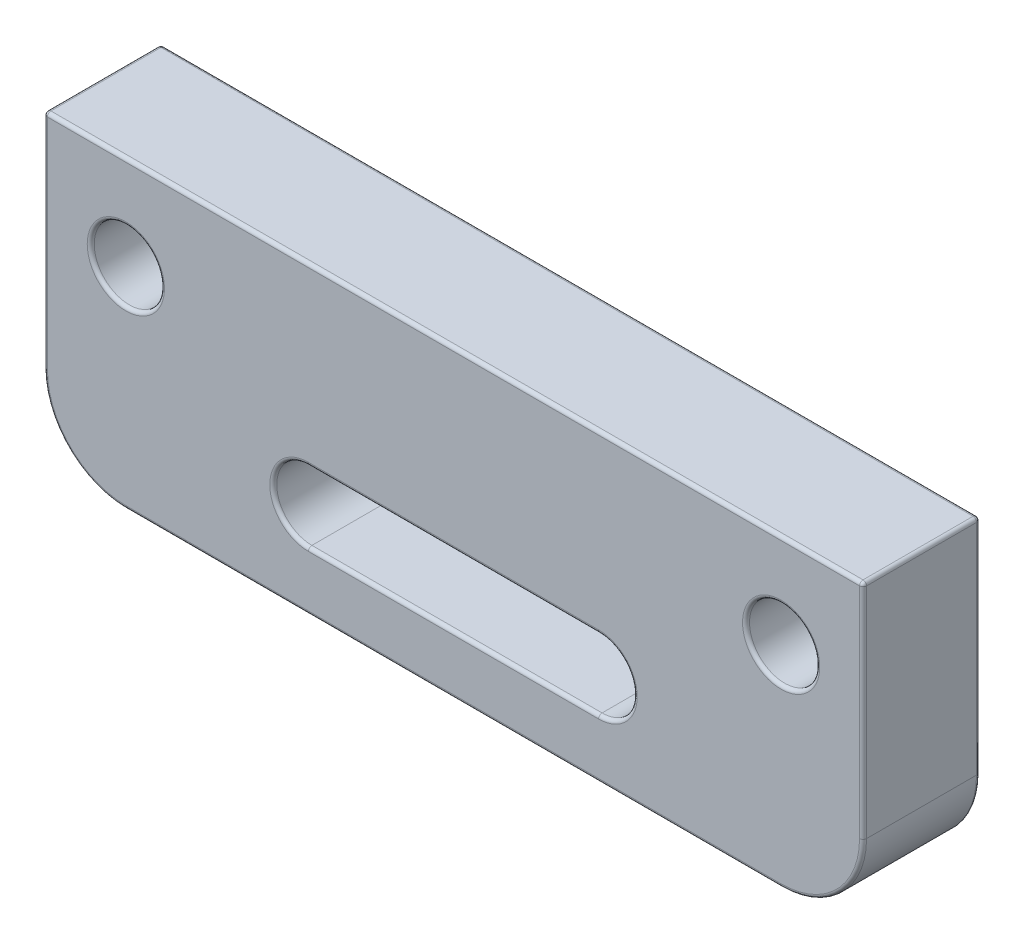
ISO-10303-21;
HEADER;
FILE_DESCRIPTION(('STEP AP214'),'2;1');
FILE_NAME('part.step','',(''),(''),'','','');
FILE_SCHEMA(('AUTOMOTIVE_DESIGN { 1 0 10303 214 1 1 1 1 }'));
ENDSEC;
DATA;
#1=APPLICATION_CONTEXT('core data for automotive mechanical design processes');
#2=APPLICATION_PROTOCOL_DEFINITION('international standard','automotive_design',2000,#1);
#3=PRODUCT_CONTEXT('',#1,'mechanical');
#4=PRODUCT('Part','Part','',(#3));
#5=PRODUCT_RELATED_PRODUCT_CATEGORY('part','',(#4));
#6=PRODUCT_DEFINITION_FORMATION('','',#4);
#7=PRODUCT_DEFINITION_CONTEXT('part definition',#1,'design');
#8=PRODUCT_DEFINITION('design','',#6,#7);
#9=PRODUCT_DEFINITION_SHAPE('','',#8);
#10=(LENGTH_UNIT() NAMED_UNIT(*) SI_UNIT(.MILLI.,.METRE.));
#11=(NAMED_UNIT(*) PLANE_ANGLE_UNIT() SI_UNIT($,.RADIAN.));
#12=(NAMED_UNIT(*) SI_UNIT($,.STERADIAN.) SOLID_ANGLE_UNIT());
#13=UNCERTAINTY_MEASURE_WITH_UNIT(LENGTH_MEASURE(1.E-05),#10,'distance_accuracy_value','');
#14=(GEOMETRIC_REPRESENTATION_CONTEXT(3) GLOBAL_UNCERTAINTY_ASSIGNED_CONTEXT((#13)) GLOBAL_UNIT_ASSIGNED_CONTEXT((#10,
#11,#12)) REPRESENTATION_CONTEXT('',''));
#15=CARTESIAN_POINT('',(0.,0.,0.));
#16=DIRECTION('',(0.,0.,1.));
#17=DIRECTION('',(1.,0.,0.));
#18=AXIS2_PLACEMENT_3D('',#15,#16,#17);
#19=CARTESIAN_POINT('',(0.,8.49264705882353,5.));
#20=DIRECTION('',(0.,0.,-1.));
#21=DIRECTION('',(-1.,0.,0.));
#22=AXIS2_PLACEMENT_3D('',#19,#20,#21);
#23=PLANE('',#22);
#24=CARTESIAN_POINT('',(14.,-15.5,5.));
#25=DIRECTION('',(0.,0.,-1.));
#26=DIRECTION('',(-1.,0.,0.));
#27=AXIS2_PLACEMENT_3D('',#24,#25,#26);
#28=CIRCLE('',#27,3.35);
#29=CARTESIAN_POINT('',(14.,-18.85,5.));
#30=VERTEX_POINT('',#29);
#31=CARTESIAN_POINT('',(17.35,-15.5,5.));
#32=VERTEX_POINT('',#31);
#33=EDGE_CURVE('E41',#30,#32,#28,.F.);
#34=ORIENTED_EDGE('',*,*,#33,.T.);
#35=DIRECTION('',(0.,1.,0.));
#36=VECTOR('',#35,1.);
#37=CARTESIAN_POINT('',(17.35,8.49264705882353,5.));
#38=LINE('',#37,#36);
#39=CARTESIAN_POINT('',(17.35,-6.15,5.));
#40=VERTEX_POINT('',#39);
#41=EDGE_CURVE('E11',#32,#40,#38,.T.);
#42=ORIENTED_EDGE('',*,*,#41,.T.);
#43=DIRECTION('',(1.,0.,0.));
#44=VECTOR('',#43,1.);
#45=CARTESIAN_POINT('',(-17.5,-6.15,5.));
#46=LINE('',#45,#44);
#47=CARTESIAN_POINT('',(-17.35,-6.15,5.));
#48=VERTEX_POINT('',#47);
#49=EDGE_CURVE('E323',#40,#48,#46,.F.);
#50=ORIENTED_EDGE('',*,*,#49,.T.);
#51=DIRECTION('',(0.,-1.,0.));
#52=VECTOR('',#51,1.);
#53=CARTESIAN_POINT('',(-17.35,8.49264705882353,5.));
#54=LINE('',#53,#52);
#55=CARTESIAN_POINT('',(-17.35,-15.5,5.));
#56=VERTEX_POINT('',#55);
#57=EDGE_CURVE('E325',#48,#56,#54,.T.);
#58=ORIENTED_EDGE('',*,*,#57,.T.);
#59=CARTESIAN_POINT('',(-14.,-15.5,5.));
#60=DIRECTION('',(0.,0.,-1.));
#61=DIRECTION('',(-1.,0.,0.));
#62=AXIS2_PLACEMENT_3D('',#59,#60,#61);
#63=CIRCLE('',#62,3.35);
#64=CARTESIAN_POINT('',(-14.,-18.85,5.));
#65=VERTEX_POINT('',#64);
#66=EDGE_CURVE('E327',#56,#65,#63,.F.);
#67=ORIENTED_EDGE('',*,*,#66,.T.);
#68=DIRECTION('',(1.,0.,0.));
#69=VECTOR('',#68,1.);
#70=CARTESIAN_POINT('',(0.,-18.85,5.));
#71=LINE('',#70,#69);
#72=EDGE_CURVE('E52',#65,#30,#71,.T.);
#73=ORIENTED_EDGE('',*,*,#72,.T.);
#74=EDGE_LOOP('',(#34,#42,#50,#58,#67,#73));
#75=FACE_BOUND('',#74,.T.);
#76=CARTESIAN_POINT('',(-14.,-10.,5.));
#77=DIRECTION('',(0.,0.,-1.));
#78=DIRECTION('',(-1.,0.,0.));
#79=AXIS2_PLACEMENT_3D('',#76,#77,#78);
#80=CIRCLE('',#79,1.65);
#81=CARTESIAN_POINT('',(-15.65,-10.,5.));
#82=VERTEX_POINT('',#81);
#83=EDGE_CURVE('E320',#82,#82,#80,.T.);
#84=ORIENTED_EDGE('',*,*,#83,.T.);
#85=EDGE_LOOP('',(#84));
#86=FACE_BOUND('',#85,.T.);
#87=CARTESIAN_POINT('',(6.2,-15.,5.));
#88=DIRECTION('',(0.,0.,-1.));
#89=DIRECTION('',(-1.,0.,0.));
#90=AXIS2_PLACEMENT_3D('',#87,#88,#89);
#91=CIRCLE('',#90,1.65);
#92=CARTESIAN_POINT('',(6.2,-13.35,5.));
#93=VERTEX_POINT('',#92);
#94=CARTESIAN_POINT('',(6.2,-16.65,5.));
#95=VERTEX_POINT('',#94);
#96=EDGE_CURVE('E315',#93,#95,#91,.T.);
#97=ORIENTED_EDGE('',*,*,#96,.T.);
#98=DIRECTION('',(1.,0.,0.));
#99=VECTOR('',#98,1.);
#100=CARTESIAN_POINT('',(-6.2,-16.65,5.));
#101=LINE('',#100,#99);
#102=CARTESIAN_POINT('',(-6.2,-16.65,5.));
#103=VERTEX_POINT('',#102);
#104=EDGE_CURVE('E317',#95,#103,#101,.F.);
#105=ORIENTED_EDGE('',*,*,#104,.T.);
#106=CARTESIAN_POINT('',(-6.2,-15.,5.));
#107=DIRECTION('',(0.,0.,-1.));
#108=DIRECTION('',(-1.,0.,0.));
#109=AXIS2_PLACEMENT_3D('',#106,#107,#108);
#110=CIRCLE('',#109,1.65);
#111=CARTESIAN_POINT('',(-6.2,-13.35,5.));
#112=VERTEX_POINT('',#111);
#113=EDGE_CURVE('E311',#103,#112,#110,.T.);
#114=ORIENTED_EDGE('',*,*,#113,.T.);
#115=DIRECTION('',(-1.,0.,0.));
#116=VECTOR('',#115,1.);
#117=CARTESIAN_POINT('',(6.2,-13.35,5.));
#118=LINE('',#117,#116);
#119=EDGE_CURVE('E313',#112,#93,#118,.F.);
#120=ORIENTED_EDGE('',*,*,#119,.T.);
#121=EDGE_LOOP('',(#97,#105,#114,#120));
#122=FACE_BOUND('',#121,.T.);
#123=CARTESIAN_POINT('',(14.,-10.,5.));
#124=DIRECTION('',(0.,0.,-1.));
#125=DIRECTION('',(-1.,0.,0.));
#126=AXIS2_PLACEMENT_3D('',#123,#124,#125);
#127=CIRCLE('',#126,1.65);
#128=CARTESIAN_POINT('',(12.35,-10.,5.));
#129=VERTEX_POINT('',#128);
#130=EDGE_CURVE('E308',#129,#129,#127,.T.);
#131=ORIENTED_EDGE('',*,*,#130,.T.);
#132=EDGE_LOOP('',(#131));
#133=FACE_BOUND('',#132,.T.);
#134=ADVANCED_FACE('F32',(#75,#86,#122,#133),#23,.F.);
#135=CARTESIAN_POINT('',(0.,8.49264705882353,0.));
#136=DIRECTION('',(0.,0.,-1.));
#137=DIRECTION('',(-1.,0.,0.));
#138=AXIS2_PLACEMENT_3D('',#135,#136,#137);
#139=PLANE('',#138);
#140=DIRECTION('',(1.,0.,0.));
#141=VECTOR('',#140,1.);
#142=CARTESIAN_POINT('',(-14.,-18.85,0.));
#143=LINE('',#142,#141);
#144=CARTESIAN_POINT('',(14.,-18.85,0.));
#145=VERTEX_POINT('',#144);
#146=CARTESIAN_POINT('',(-14.,-18.85,0.));
#147=VERTEX_POINT('',#146);
#148=EDGE_CURVE('E261',#145,#147,#143,.F.);
#149=ORIENTED_EDGE('',*,*,#148,.T.);
#150=CARTESIAN_POINT('',(-14.,-15.5,0.));
#151=DIRECTION('',(0.,0.,-1.));
#152=DIRECTION('',(-1.,0.,0.));
#153=AXIS2_PLACEMENT_3D('',#150,#151,#152);
#154=CIRCLE('',#153,3.35);
#155=CARTESIAN_POINT('',(-17.35,-15.5,0.));
#156=VERTEX_POINT('',#155);
#157=EDGE_CURVE('E263',#147,#156,#154,.T.);
#158=ORIENTED_EDGE('',*,*,#157,.T.);
#159=DIRECTION('',(0.,-1.,0.));
#160=VECTOR('',#159,1.);
#161=CARTESIAN_POINT('',(-17.35,-6.,0.));
#162=LINE('',#161,#160);
#163=CARTESIAN_POINT('',(-17.35,-6.15,0.));
#164=VERTEX_POINT('',#163);
#165=EDGE_CURVE('E253',#156,#164,#162,.F.);
#166=ORIENTED_EDGE('',*,*,#165,.T.);
#167=DIRECTION('',(1.,0.,0.));
#168=VECTOR('',#167,1.);
#169=CARTESIAN_POINT('',(0.,-6.15,0.));
#170=LINE('',#169,#168);
#171=CARTESIAN_POINT('',(17.35,-6.15,0.));
#172=VERTEX_POINT('',#171);
#173=EDGE_CURVE('E255',#164,#172,#170,.T.);
#174=ORIENTED_EDGE('',*,*,#173,.T.);
#175=DIRECTION('',(0.,1.,0.));
#176=VECTOR('',#175,1.);
#177=CARTESIAN_POINT('',(17.35,-15.5,0.));
#178=LINE('',#177,#176);
#179=CARTESIAN_POINT('',(17.35,-15.5,0.));
#180=VERTEX_POINT('',#179);
#181=EDGE_CURVE('E257',#172,#180,#178,.F.);
#182=ORIENTED_EDGE('',*,*,#181,.T.);
#183=CARTESIAN_POINT('',(14.,-15.5,0.));
#184=DIRECTION('',(0.,0.,-1.));
#185=DIRECTION('',(-1.,0.,0.));
#186=AXIS2_PLACEMENT_3D('',#183,#184,#185);
#187=CIRCLE('',#186,3.35);
#188=EDGE_CURVE('E259',#180,#145,#187,.T.);
#189=ORIENTED_EDGE('',*,*,#188,.T.);
#190=EDGE_LOOP('',(#149,#158,#166,#174,#182,#189));
#191=FACE_BOUND('',#190,.T.);
#192=CARTESIAN_POINT('',(-14.,-10.,0.));
#193=DIRECTION('',(0.,0.,-1.));
#194=DIRECTION('',(-1.,0.,0.));
#195=AXIS2_PLACEMENT_3D('',#192,#193,#194);
#196=CIRCLE('',#195,1.65);
#197=CARTESIAN_POINT('',(-15.65,-10.,0.));
#198=VERTEX_POINT('',#197);
#199=EDGE_CURVE('E250',#198,#198,#196,.F.);
#200=ORIENTED_EDGE('',*,*,#199,.T.);
#201=EDGE_LOOP('',(#200));
#202=FACE_BOUND('',#201,.T.);
#203=DIRECTION('',(1.,0.,0.));
#204=VECTOR('',#203,1.);
#205=CARTESIAN_POINT('',(0.,-16.65,0.));
#206=LINE('',#205,#204);
#207=CARTESIAN_POINT('',(-6.2,-16.65,0.));
#208=VERTEX_POINT('',#207);
#209=CARTESIAN_POINT('',(6.2,-16.65,0.));
#210=VERTEX_POINT('',#209);
#211=EDGE_CURVE('E245',#208,#210,#206,.T.);
#212=ORIENTED_EDGE('',*,*,#211,.T.);
#213=CARTESIAN_POINT('',(6.2,-15.,0.));
#214=DIRECTION('',(0.,0.,-1.));
#215=DIRECTION('',(-1.,0.,0.));
#216=AXIS2_PLACEMENT_3D('',#213,#214,#215);
#217=CIRCLE('',#216,1.65);
#218=CARTESIAN_POINT('',(6.2,-13.35,0.));
#219=VERTEX_POINT('',#218);
#220=EDGE_CURVE('E247',#210,#219,#217,.F.);
#221=ORIENTED_EDGE('',*,*,#220,.T.);
#222=DIRECTION('',(-1.,0.,0.));
#223=VECTOR('',#222,1.);
#224=CARTESIAN_POINT('',(0.,-13.35,0.));
#225=LINE('',#224,#223);
#226=CARTESIAN_POINT('',(-6.2,-13.35,0.));
#227=VERTEX_POINT('',#226);
#228=EDGE_CURVE('E241',#219,#227,#225,.T.);
#229=ORIENTED_EDGE('',*,*,#228,.T.);
#230=CARTESIAN_POINT('',(-6.2,-15.,0.));
#231=DIRECTION('',(0.,0.,-1.));
#232=DIRECTION('',(-1.,0.,0.));
#233=AXIS2_PLACEMENT_3D('',#230,#231,#232);
#234=CIRCLE('',#233,1.65);
#235=EDGE_CURVE('E243',#227,#208,#234,.F.);
#236=ORIENTED_EDGE('',*,*,#235,.T.);
#237=EDGE_LOOP('',(#212,#221,#229,#236));
#238=FACE_BOUND('',#237,.T.);
#239=CARTESIAN_POINT('',(14.,-10.,0.));
#240=DIRECTION('',(0.,0.,-1.));
#241=DIRECTION('',(-1.,0.,0.));
#242=AXIS2_PLACEMENT_3D('',#239,#240,#241);
#243=CIRCLE('',#242,1.65);
#244=CARTESIAN_POINT('',(12.35,-10.,0.));
#245=VERTEX_POINT('',#244);
#246=EDGE_CURVE('E238',#245,#245,#243,.F.);
#247=ORIENTED_EDGE('',*,*,#246,.T.);
#248=EDGE_LOOP('',(#247));
#249=FACE_BOUND('',#248,.T.);
#250=ADVANCED_FACE('F488',(#191,#202,#238,#249),#139,.T.);
#251=CARTESIAN_POINT('',(-17.5,9.,5.));
#252=DIRECTION('',(1.,0.,0.));
#253=DIRECTION('',(0.,0.,-1.));
#254=AXIS2_PLACEMENT_3D('',#251,#252,#253);
#255=PLANE('',#254);
#256=DIRECTION('',(0.,0.,1.));
#257=VECTOR('',#256,1.);
#258=CARTESIAN_POINT('',(-17.5,-6.15,0.));
#259=LINE('',#258,#257);
#260=CARTESIAN_POINT('',(-17.5,-6.15,4.85));
#261=VERTEX_POINT('',#260);
#262=CARTESIAN_POINT('',(-17.5,-6.15,0.15));
#263=VERTEX_POINT('',#262);
#264=EDGE_CURVE('E199',#261,#263,#259,.F.);
#265=ORIENTED_EDGE('',*,*,#264,.T.);
#266=DIRECTION('',(0.,-1.,0.));
#267=VECTOR('',#266,1.);
#268=CARTESIAN_POINT('',(-17.5,-15.5,0.15));
#269=LINE('',#268,#267);
#270=CARTESIAN_POINT('',(-17.5,-15.5,0.15));
#271=VERTEX_POINT('',#270);
#272=EDGE_CURVE('E236',#263,#271,#269,.T.);
#273=ORIENTED_EDGE('',*,*,#272,.T.);
#274=DIRECTION('',(0.,0.,-1.));
#275=VECTOR('',#274,1.);
#276=CARTESIAN_POINT('',(-17.5,-15.5,5.));
#277=LINE('',#276,#275);
#278=CARTESIAN_POINT('',(-17.5,-15.5,4.85));
#279=VERTEX_POINT('',#278);
#280=EDGE_CURVE('E217',#271,#279,#277,.F.);
#281=ORIENTED_EDGE('',*,*,#280,.T.);
#282=DIRECTION('',(0.,-1.,0.));
#283=VECTOR('',#282,1.);
#284=CARTESIAN_POINT('',(-17.5,9.,4.85));
#285=LINE('',#284,#283);
#286=EDGE_CURVE('E233',#279,#261,#285,.F.);
#287=ORIENTED_EDGE('',*,*,#286,.T.);
#288=EDGE_LOOP('',(#265,#273,#281,#287));
#289=FACE_BOUND('',#288,.T.);
#290=ADVANCED_FACE('F473',(#289),#255,.F.);
#291=CARTESIAN_POINT('',(17.5,9.,5.));
#292=DIRECTION('',(-1.,0.,0.));
#293=DIRECTION('',(0.,0.,1.));
#294=AXIS2_PLACEMENT_3D('',#291,#292,#293);
#295=PLANE('',#294);
#296=DIRECTION('',(0.,0.,-1.));
#297=VECTOR('',#296,1.);
#298=CARTESIAN_POINT('',(17.5,-15.5,5.));
#299=LINE('',#298,#297);
#300=CARTESIAN_POINT('',(17.5,-15.5,4.85));
#301=VERTEX_POINT('',#300);
#302=CARTESIAN_POINT('',(17.5,-15.5,0.15));
#303=VERTEX_POINT('',#302);
#304=EDGE_CURVE('E429',#301,#303,#299,.T.);
#305=ORIENTED_EDGE('',*,*,#304,.T.);
#306=DIRECTION('',(0.,1.,0.));
#307=VECTOR('',#306,1.);
#308=CARTESIAN_POINT('',(17.5,-6.,0.15));
#309=LINE('',#308,#307);
#310=CARTESIAN_POINT('',(17.5,-6.15,0.15));
#311=VERTEX_POINT('',#310);
#312=EDGE_CURVE('E231',#303,#311,#309,.T.);
#313=ORIENTED_EDGE('',*,*,#312,.T.);
#314=DIRECTION('',(0.,0.,-1.));
#315=VECTOR('',#314,1.);
#316=CARTESIAN_POINT('',(17.5,-6.15,5.));
#317=LINE('',#316,#315);
#318=CARTESIAN_POINT('',(17.5,-6.15,4.85));
#319=VERTEX_POINT('',#318);
#320=EDGE_CURVE('E228',#311,#319,#317,.F.);
#321=ORIENTED_EDGE('',*,*,#320,.T.);
#322=DIRECTION('',(0.,1.,0.));
#323=VECTOR('',#322,1.);
#324=CARTESIAN_POINT('',(17.5,9.,4.85));
#325=LINE('',#324,#323);
#326=EDGE_CURVE('E226',#319,#301,#325,.F.);
#327=ORIENTED_EDGE('',*,*,#326,.T.);
#328=EDGE_LOOP('',(#305,#313,#321,#327));
#329=FACE_BOUND('',#328,.T.);
#330=ADVANCED_FACE('F524',(#329),#295,.F.);
#331=CARTESIAN_POINT('',(-17.5,-19.,5.));
#332=DIRECTION('',(0.,1.,0.));
#333=DIRECTION('',(0.,0.,1.));
#334=AXIS2_PLACEMENT_3D('',#331,#332,#333);
#335=PLANE('',#334);
#336=DIRECTION('',(0.,0.,-1.));
#337=VECTOR('',#336,1.);
#338=CARTESIAN_POINT('',(-14.,-19.,5.));
#339=LINE('',#338,#337);
#340=CARTESIAN_POINT('',(-14.,-19.,4.85));
#341=VERTEX_POINT('',#340);
#342=CARTESIAN_POINT('',(-14.,-19.,0.15));
#343=VERTEX_POINT('',#342);
#344=EDGE_CURVE('E436',#341,#343,#339,.T.);
#345=ORIENTED_EDGE('',*,*,#344,.T.);
#346=DIRECTION('',(1.,0.,0.));
#347=VECTOR('',#346,1.);
#348=CARTESIAN_POINT('',(14.,-19.,0.15));
#349=LINE('',#348,#347);
#350=CARTESIAN_POINT('',(14.,-19.,0.15));
#351=VERTEX_POINT('',#350);
#352=EDGE_CURVE('E272',#343,#351,#349,.T.);
#353=ORIENTED_EDGE('',*,*,#352,.T.);
#354=DIRECTION('',(0.,0.,-1.));
#355=VECTOR('',#354,1.);
#356=CARTESIAN_POINT('',(14.,-19.,5.));
#357=LINE('',#356,#355);
#358=CARTESIAN_POINT('',(14.,-19.,4.85));
#359=VERTEX_POINT('',#358);
#360=EDGE_CURVE('E220',#351,#359,#357,.F.);
#361=ORIENTED_EDGE('',*,*,#360,.T.);
#362=DIRECTION('',(1.,0.,0.));
#363=VECTOR('',#362,1.);
#364=CARTESIAN_POINT('',(-17.5,-19.,4.85));
#365=LINE('',#364,#363);
#366=EDGE_CURVE('E270',#359,#341,#365,.F.);
#367=ORIENTED_EDGE('',*,*,#366,.T.);
#368=EDGE_LOOP('',(#345,#353,#361,#367));
#369=FACE_BOUND('',#368,.T.);
#370=ADVANCED_FACE('F442',(#369),#335,.F.);
#371=CARTESIAN_POINT('',(11.5,-6.,5.));
#372=DIRECTION('',(0.,1.,0.));
#373=DIRECTION('',(-1.,0.,0.));
#374=AXIS2_PLACEMENT_3D('',#371,#372,#373);
#375=PLANE('',#374);
#376=DIRECTION('',(0.,0.,-1.));
#377=VECTOR('',#376,1.);
#378=CARTESIAN_POINT('',(17.35,-6.,0.));
#379=LINE('',#378,#377);
#380=CARTESIAN_POINT('',(17.35,-6.,4.85));
#381=VERTEX_POINT('',#380);
#382=CARTESIAN_POINT('',(17.35,-6.,0.15));
#383=VERTEX_POINT('',#382);
#384=EDGE_CURVE('E192',#381,#383,#379,.T.);
#385=ORIENTED_EDGE('',*,*,#384,.T.);
#386=DIRECTION('',(1.,0.,0.));
#387=VECTOR('',#386,1.);
#388=CARTESIAN_POINT('',(11.5,-6.,0.15));
#389=LINE('',#388,#387);
#390=CARTESIAN_POINT('',(-17.35,-6.,0.15));
#391=VERTEX_POINT('',#390);
#392=EDGE_CURVE('E188',#383,#391,#389,.F.);
#393=ORIENTED_EDGE('',*,*,#392,.T.);
#394=DIRECTION('',(0.,0.,1.));
#395=VECTOR('',#394,1.);
#396=CARTESIAN_POINT('',(-17.35,-6.,5.));
#397=LINE('',#396,#395);
#398=CARTESIAN_POINT('',(-17.35,-6.,4.85));
#399=VERTEX_POINT('',#398);
#400=EDGE_CURVE('E180',#391,#399,#397,.T.);
#401=ORIENTED_EDGE('',*,*,#400,.T.);
#402=DIRECTION('',(1.,0.,0.));
#403=VECTOR('',#402,1.);
#404=CARTESIAN_POINT('',(17.5,-6.,4.85));
#405=LINE('',#404,#403);
#406=EDGE_CURVE('E185',#399,#381,#405,.T.);
#407=ORIENTED_EDGE('',*,*,#406,.T.);
#408=EDGE_LOOP('',(#385,#393,#401,#407));
#409=FACE_BOUND('',#408,.T.);
#410=ADVANCED_FACE('F183',(#409),#375,.T.);
#411=CARTESIAN_POINT('',(-14.,-10.,5.));
#412=DIRECTION('',(0.,0.,-1.));
#413=DIRECTION('',(-1.,0.,0.));
#414=AXIS2_PLACEMENT_3D('',#411,#412,#413);
#415=CYLINDRICAL_SURFACE('',#414,1.5);
#416=CARTESIAN_POINT('',(-14.,-10.,0.15));
#417=DIRECTION('',(0.,0.,-1.));
#418=DIRECTION('',(-1.,0.,0.));
#419=AXIS2_PLACEMENT_3D('',#416,#417,#418);
#420=CIRCLE('',#419,1.5);
#421=CARTESIAN_POINT('',(-15.5,-10.,0.15));
#422=VERTEX_POINT('',#421);
#423=EDGE_CURVE('E281',#422,#422,#420,.T.);
#424=ORIENTED_EDGE('',*,*,#423,.T.);
#425=EDGE_LOOP('',(#424));
#426=FACE_BOUND('',#425,.T.);
#427=CARTESIAN_POINT('',(-14.,-10.,4.85));
#428=DIRECTION('',(0.,0.,-1.));
#429=DIRECTION('',(-1.,0.,0.));
#430=AXIS2_PLACEMENT_3D('',#427,#428,#429);
#431=CIRCLE('',#430,1.5);
#432=CARTESIAN_POINT('',(-15.5,-10.,4.85));
#433=VERTEX_POINT('',#432);
#434=EDGE_CURVE('E278',#433,#433,#431,.F.);
#435=ORIENTED_EDGE('',*,*,#434,.T.);
#436=EDGE_LOOP('',(#435));
#437=FACE_BOUND('',#436,.T.);
#438=ADVANCED_FACE('F795',(#426,#437),#415,.F.);
#439=CARTESIAN_POINT('',(-6.2,-15.,5.));
#440=DIRECTION('',(0.,0.,-1.));
#441=DIRECTION('',(-1.,0.,0.));
#442=AXIS2_PLACEMENT_3D('',#439,#440,#441);
#443=CYLINDRICAL_SURFACE('',#442,1.5);
#444=DIRECTION('',(0.,0.,-1.));
#445=VECTOR('',#444,1.);
#446=CARTESIAN_POINT('',(-6.2,-16.5,5.));
#447=LINE('',#446,#445);
#448=CARTESIAN_POINT('',(-6.2,-16.5,4.85));
#449=VERTEX_POINT('',#448);
#450=CARTESIAN_POINT('',(-6.2,-16.5,0.15));
#451=VERTEX_POINT('',#450);
#452=EDGE_CURVE('E424',#449,#451,#447,.T.);
#453=ORIENTED_EDGE('',*,*,#452,.T.);
#454=CARTESIAN_POINT('',(-6.2,-15.,0.15));
#455=DIRECTION('',(0.,0.,-1.));
#456=DIRECTION('',(-1.,0.,0.));
#457=AXIS2_PLACEMENT_3D('',#454,#455,#456);
#458=CIRCLE('',#457,1.5);
#459=CARTESIAN_POINT('',(-6.2,-13.5,0.15));
#460=VERTEX_POINT('',#459);
#461=EDGE_CURVE('E296',#451,#460,#458,.T.);
#462=ORIENTED_EDGE('',*,*,#461,.T.);
#463=DIRECTION('',(0.,0.,-1.));
#464=VECTOR('',#463,1.);
#465=CARTESIAN_POINT('',(-6.2,-13.5,5.));
#466=LINE('',#465,#464);
#467=CARTESIAN_POINT('',(-6.2,-13.5,4.85));
#468=VERTEX_POINT('',#467);
#469=EDGE_CURVE('E376',#468,#460,#466,.T.);
#470=ORIENTED_EDGE('',*,*,#469,.F.);
#471=CARTESIAN_POINT('',(-6.2,-15.,4.85));
#472=DIRECTION('',(0.,0.,-1.));
#473=DIRECTION('',(-1.,0.,0.));
#474=AXIS2_PLACEMENT_3D('',#471,#472,#473);
#475=CIRCLE('',#474,1.5);
#476=EDGE_CURVE('E294',#468,#449,#475,.F.);
#477=ORIENTED_EDGE('',*,*,#476,.T.);
#478=EDGE_LOOP('',(#453,#462,#470,#477));
#479=FACE_BOUND('',#478,.T.);
#480=ADVANCED_FACE('F860',(#479),#443,.F.);
#481=CARTESIAN_POINT('',(-6.2,-16.5,5.));
#482=DIRECTION('',(0.,1.,0.));
#483=DIRECTION('',(0.,0.,1.));
#484=AXIS2_PLACEMENT_3D('',#481,#482,#483);
#485=PLANE('',#484);
#486=DIRECTION('',(0.,0.,-1.));
#487=VECTOR('',#486,1.);
#488=CARTESIAN_POINT('',(6.2,-16.5,5.));
#489=LINE('',#488,#487);
#490=CARTESIAN_POINT('',(6.2,-16.5,4.85));
#491=VERTEX_POINT('',#490);
#492=CARTESIAN_POINT('',(6.2,-16.5,0.15));
#493=VERTEX_POINT('',#492);
#494=EDGE_CURVE('E422',#491,#493,#489,.T.);
#495=ORIENTED_EDGE('',*,*,#494,.T.);
#496=DIRECTION('',(1.,0.,0.));
#497=VECTOR('',#496,1.);
#498=CARTESIAN_POINT('',(-6.2,-16.5,0.15));
#499=LINE('',#498,#497);
#500=EDGE_CURVE('E292',#493,#451,#499,.F.);
#501=ORIENTED_EDGE('',*,*,#500,.T.);
#502=ORIENTED_EDGE('',*,*,#452,.F.);
#503=DIRECTION('',(1.,0.,0.));
#504=VECTOR('',#503,1.);
#505=CARTESIAN_POINT('',(6.2,-16.5,4.85));
#506=LINE('',#505,#504);
#507=EDGE_CURVE('E289',#449,#491,#506,.T.);
#508=ORIENTED_EDGE('',*,*,#507,.T.);
#509=EDGE_LOOP('',(#495,#501,#502,#508));
#510=FACE_BOUND('',#509,.T.);
#511=ADVANCED_FACE('F421',(#510),#485,.T.);
#512=CARTESIAN_POINT('',(6.2,-15.,5.));
#513=DIRECTION('',(0.,0.,-1.));
#514=DIRECTION('',(-1.,0.,0.));
#515=AXIS2_PLACEMENT_3D('',#512,#513,#514);
#516=CYLINDRICAL_SURFACE('',#515,1.5);
#517=DIRECTION('',(0.,0.,-1.));
#518=VECTOR('',#517,1.);
#519=CARTESIAN_POINT('',(6.2,-13.5,5.));
#520=LINE('',#519,#518);
#521=CARTESIAN_POINT('',(6.2,-13.5,4.85));
#522=VERTEX_POINT('',#521);
#523=CARTESIAN_POINT('',(6.2,-13.5,0.15));
#524=VERTEX_POINT('',#523);
#525=EDGE_CURVE('E427',#522,#524,#520,.T.);
#526=ORIENTED_EDGE('',*,*,#525,.T.);
#527=CARTESIAN_POINT('',(6.2,-15.,0.15));
#528=DIRECTION('',(0.,0.,-1.));
#529=DIRECTION('',(-1.,0.,0.));
#530=AXIS2_PLACEMENT_3D('',#527,#528,#529);
#531=CIRCLE('',#530,1.5);
#532=EDGE_CURVE('E286',#524,#493,#531,.T.);
#533=ORIENTED_EDGE('',*,*,#532,.T.);
#534=ORIENTED_EDGE('',*,*,#494,.F.);
#535=CARTESIAN_POINT('',(6.2,-15.,4.85));
#536=DIRECTION('',(0.,0.,-1.));
#537=DIRECTION('',(-1.,0.,0.));
#538=AXIS2_PLACEMENT_3D('',#535,#536,#537);
#539=CIRCLE('',#538,1.5);
#540=EDGE_CURVE('E284',#491,#522,#539,.F.);
#541=ORIENTED_EDGE('',*,*,#540,.T.);
#542=EDGE_LOOP('',(#526,#533,#534,#541));
#543=FACE_BOUND('',#542,.T.);
#544=ADVANCED_FACE('F425',(#543),#516,.F.);
#545=CARTESIAN_POINT('',(-6.2,-13.5,5.));
#546=DIRECTION('',(0.,-1.,0.));
#547=DIRECTION('',(0.,0.,-1.));
#548=AXIS2_PLACEMENT_3D('',#545,#546,#547);
#549=PLANE('',#548);
#550=ORIENTED_EDGE('',*,*,#469,.T.);
#551=DIRECTION('',(-1.,0.,0.));
#552=VECTOR('',#551,1.);
#553=CARTESIAN_POINT('',(-6.2,-13.5,0.15));
#554=LINE('',#553,#552);
#555=EDGE_CURVE('E300',#460,#524,#554,.F.);
#556=ORIENTED_EDGE('',*,*,#555,.T.);
#557=ORIENTED_EDGE('',*,*,#525,.F.);
#558=DIRECTION('',(-1.,0.,0.));
#559=VECTOR('',#558,1.);
#560=CARTESIAN_POINT('',(-6.2,-13.5,4.85));
#561=LINE('',#560,#559);
#562=EDGE_CURVE('E298',#522,#468,#561,.T.);
#563=ORIENTED_EDGE('',*,*,#562,.T.);
#564=EDGE_LOOP('',(#550,#556,#557,#563));
#565=FACE_BOUND('',#564,.T.);
#566=ADVANCED_FACE('F836',(#565),#549,.T.);
#567=CARTESIAN_POINT('',(14.,-10.,5.));
#568=DIRECTION('',(0.,0.,-1.));
#569=DIRECTION('',(-1.,0.,0.));
#570=AXIS2_PLACEMENT_3D('',#567,#568,#569);
#571=CYLINDRICAL_SURFACE('',#570,1.5);
#572=CARTESIAN_POINT('',(14.,-10.,0.15));
#573=DIRECTION('',(0.,0.,-1.));
#574=DIRECTION('',(-1.,0.,0.));
#575=AXIS2_PLACEMENT_3D('',#572,#573,#574);
#576=CIRCLE('',#575,1.5);
#577=CARTESIAN_POINT('',(12.5,-10.,0.15));
#578=VERTEX_POINT('',#577);
#579=EDGE_CURVE('E305',#578,#578,#576,.T.);
#580=ORIENTED_EDGE('',*,*,#579,.T.);
#581=EDGE_LOOP('',(#580));
#582=FACE_BOUND('',#581,.T.);
#583=CARTESIAN_POINT('',(14.,-10.,4.85));
#584=DIRECTION('',(0.,0.,-1.));
#585=DIRECTION('',(-1.,0.,0.));
#586=AXIS2_PLACEMENT_3D('',#583,#584,#585);
#587=CIRCLE('',#586,1.5);
#588=CARTESIAN_POINT('',(12.5,-10.,4.85));
#589=VERTEX_POINT('',#588);
#590=EDGE_CURVE('E302',#589,#589,#587,.F.);
#591=ORIENTED_EDGE('',*,*,#590,.T.);
#592=EDGE_LOOP('',(#591));
#593=FACE_BOUND('',#592,.T.);
#594=ADVANCED_FACE('F535',(#582,#593),#571,.F.);
#595=CARTESIAN_POINT('',(14.,-15.5,5.));
#596=DIRECTION('',(0.,0.,-1.));
#597=DIRECTION('',(-1.,0.,0.));
#598=AXIS2_PLACEMENT_3D('',#595,#596,#597);
#599=CYLINDRICAL_SURFACE('',#598,3.5);
#600=ORIENTED_EDGE('',*,*,#360,.F.);
#601=CARTESIAN_POINT('',(14.,-15.5,0.15));
#602=DIRECTION('',(0.,0.,-1.));
#603=DIRECTION('',(-1.,0.,0.));
#604=AXIS2_PLACEMENT_3D('',#601,#602,#603);
#605=CIRCLE('',#604,3.5);
#606=EDGE_CURVE('E276',#351,#303,#605,.F.);
#607=ORIENTED_EDGE('',*,*,#606,.T.);
#608=ORIENTED_EDGE('',*,*,#304,.F.);
#609=CARTESIAN_POINT('',(14.,-15.5,4.85));
#610=DIRECTION('',(0.,0.,-1.));
#611=DIRECTION('',(-1.,0.,0.));
#612=AXIS2_PLACEMENT_3D('',#609,#610,#611);
#613=CIRCLE('',#612,3.5);
#614=EDGE_CURVE('E274',#301,#359,#613,.T.);
#615=ORIENTED_EDGE('',*,*,#614,.T.);
#616=EDGE_LOOP('',(#600,#607,#608,#615));
#617=FACE_BOUND('',#616,.T.);
#618=ADVANCED_FACE('F532',(#617),#599,.T.);
#619=CARTESIAN_POINT('',(-14.,-15.5,5.));
#620=DIRECTION('',(0.,0.,-1.));
#621=DIRECTION('',(-1.,0.,0.));
#622=AXIS2_PLACEMENT_3D('',#619,#620,#621);
#623=CYLINDRICAL_SURFACE('',#622,3.5);
#624=ORIENTED_EDGE('',*,*,#280,.F.);
#625=CARTESIAN_POINT('',(-14.,-15.5,0.15));
#626=DIRECTION('',(0.,0.,-1.));
#627=DIRECTION('',(-1.,0.,0.));
#628=AXIS2_PLACEMENT_3D('',#625,#626,#627);
#629=CIRCLE('',#628,3.5);
#630=EDGE_CURVE('E268',#271,#343,#629,.F.);
#631=ORIENTED_EDGE('',*,*,#630,.T.);
#632=ORIENTED_EDGE('',*,*,#344,.F.);
#633=CARTESIAN_POINT('',(-14.,-15.5,4.85));
#634=DIRECTION('',(0.,0.,-1.));
#635=DIRECTION('',(-1.,0.,0.));
#636=AXIS2_PLACEMENT_3D('',#633,#634,#635);
#637=CIRCLE('',#636,3.5);
#638=EDGE_CURVE('E266',#341,#279,#637,.T.);
#639=ORIENTED_EDGE('',*,*,#638,.T.);
#640=EDGE_LOOP('',(#624,#631,#632,#639));
#641=FACE_BOUND('',#640,.T.);
#642=ADVANCED_FACE('F470',(#641),#623,.T.);
#643=CARTESIAN_POINT('',(-14.,-15.5,4.85));
#644=DIRECTION('',(0.,0.,-1.));
#645=DIRECTION('',(-1.,0.,0.));
#646=AXIS2_PLACEMENT_3D('',#643,#644,#645);
#647=TOROIDAL_SURFACE('',#646,3.35,0.15);
#648=CARTESIAN_POINT('',(-17.35,-15.5,4.85));
#649=DIRECTION('',(0.,1.,0.));
#650=DIRECTION('',(0.,0.,1.));
#651=AXIS2_PLACEMENT_3D('',#648,#649,#650);
#652=CIRCLE('',#651,0.15);
#653=EDGE_CURVE('E370',#279,#56,#652,.T.);
#654=ORIENTED_EDGE('',*,*,#653,.F.);
#655=ORIENTED_EDGE('',*,*,#638,.F.);
#656=CARTESIAN_POINT('',(-14.,-18.85,4.85));
#657=DIRECTION('',(1.,0.,0.));
#658=DIRECTION('',(0.,0.,-1.));
#659=AXIS2_PLACEMENT_3D('',#656,#657,#658);
#660=CIRCLE('',#659,0.15);
#661=EDGE_CURVE('E373',#65,#341,#660,.T.);
#662=ORIENTED_EDGE('',*,*,#661,.F.);
#663=ORIENTED_EDGE('',*,*,#66,.F.);
#664=EDGE_LOOP('',(#654,#655,#662,#663));
#665=FACE_BOUND('',#664,.T.);
#666=ADVANCED_FACE('F467',(#665),#647,.T.);
#667=CARTESIAN_POINT('',(-14.,-15.5,0.15));
#668=DIRECTION('',(0.,0.,-1.));
#669=DIRECTION('',(-1.,0.,0.));
#670=AXIS2_PLACEMENT_3D('',#667,#668,#669);
#671=TOROIDAL_SURFACE('',#670,3.35,0.15);
#672=CARTESIAN_POINT('',(-14.,-18.85,0.15));
#673=DIRECTION('',(1.,0.,0.));
#674=DIRECTION('',(0.,0.,-1.));
#675=AXIS2_PLACEMENT_3D('',#672,#673,#674);
#676=CIRCLE('',#675,0.15);
#677=EDGE_CURVE('E364',#343,#147,#676,.T.);
#678=ORIENTED_EDGE('',*,*,#677,.F.);
#679=ORIENTED_EDGE('',*,*,#630,.F.);
#680=CARTESIAN_POINT('',(-17.35,-15.5,0.15));
#681=DIRECTION('',(0.,1.,0.));
#682=DIRECTION('',(0.,0.,1.));
#683=AXIS2_PLACEMENT_3D('',#680,#681,#682);
#684=CIRCLE('',#683,0.15);
#685=EDGE_CURVE('E367',#156,#271,#684,.T.);
#686=ORIENTED_EDGE('',*,*,#685,.F.);
#687=ORIENTED_EDGE('',*,*,#157,.F.);
#688=EDGE_LOOP('',(#678,#679,#686,#687));
#689=FACE_BOUND('',#688,.T.);
#690=ADVANCED_FACE('F506',(#689),#671,.T.);
#691=CARTESIAN_POINT('',(0.,-18.85,4.85));
#692=DIRECTION('',(1.,0.,0.));
#693=DIRECTION('',(0.,0.,-1.));
#694=AXIS2_PLACEMENT_3D('',#691,#692,#693);
#695=CYLINDRICAL_SURFACE('',#694,0.15);
#696=ORIENTED_EDGE('',*,*,#661,.T.);
#697=ORIENTED_EDGE('',*,*,#366,.F.);
#698=CARTESIAN_POINT('',(14.,-18.85,4.85));
#699=DIRECTION('',(1.,0.,0.));
#700=DIRECTION('',(0.,0.,-1.));
#701=AXIS2_PLACEMENT_3D('',#698,#699,#700);
#702=CIRCLE('',#701,0.15);
#703=EDGE_CURVE('E361',#30,#359,#702,.T.);
#704=ORIENTED_EDGE('',*,*,#703,.F.);
#705=ORIENTED_EDGE('',*,*,#72,.F.);
#706=EDGE_LOOP('',(#696,#697,#704,#705));
#707=FACE_BOUND('',#706,.T.);
#708=ADVANCED_FACE('F448',(#707),#695,.T.);
#709=CARTESIAN_POINT('',(-17.35,8.49264705882353,4.85));
#710=DIRECTION('',(0.,-1.,0.));
#711=DIRECTION('',(0.,0.,-1.));
#712=AXIS2_PLACEMENT_3D('',#709,#710,#711);
#713=CYLINDRICAL_SURFACE('',#712,0.15);
#714=ORIENTED_EDGE('',*,*,#653,.T.);
#715=ORIENTED_EDGE('',*,*,#57,.F.);
#716=CARTESIAN_POINT('',(-17.35,-6.15,4.85));
#717=DIRECTION('',(0.,1.,0.));
#718=DIRECTION('',(0.,0.,1.));
#719=AXIS2_PLACEMENT_3D('',#716,#717,#718);
#720=CIRCLE('',#719,0.15);
#721=EDGE_CURVE('E203',#261,#48,#720,.T.);
#722=ORIENTED_EDGE('',*,*,#721,.F.);
#723=ORIENTED_EDGE('',*,*,#286,.F.);
#724=EDGE_LOOP('',(#714,#715,#722,#723));
#725=FACE_BOUND('',#724,.T.);
#726=ADVANCED_FACE('F462',(#725),#713,.T.);
#727=CARTESIAN_POINT('',(-17.35,-6.15,5.));
#728=DIRECTION('',(0.,0.,-1.));
#729=DIRECTION('',(-1.,0.,0.));
#730=AXIS2_PLACEMENT_3D('',#727,#728,#729);
#731=CYLINDRICAL_SURFACE('',#730,0.15);
#732=CARTESIAN_POINT('',(-17.35,-6.15,0.15));
#733=DIRECTION('',(0.,0.,-1.));
#734=DIRECTION('',(0.,1.,0.));
#735=AXIS2_PLACEMENT_3D('',#732,#733,#734);
#736=CIRCLE('',#735,0.15);
#737=EDGE_CURVE('E204',#263,#391,#736,.T.);
#738=ORIENTED_EDGE('',*,*,#737,.F.);
#739=ORIENTED_EDGE('',*,*,#264,.F.);
#740=CARTESIAN_POINT('',(-17.35,-6.15,4.85));
#741=DIRECTION('',(0.,0.,1.));
#742=DIRECTION('',(1.,0.,0.));
#743=AXIS2_PLACEMENT_3D('',#740,#741,#742);
#744=CIRCLE('',#743,0.15);
#745=EDGE_CURVE('E196',#399,#261,#744,.T.);
#746=ORIENTED_EDGE('',*,*,#745,.F.);
#747=ORIENTED_EDGE('',*,*,#400,.F.);
#748=EDGE_LOOP('',(#738,#739,#746,#747));
#749=FACE_BOUND('',#748,.T.);
#750=ADVANCED_FACE('F198',(#749),#731,.T.);
#751=CARTESIAN_POINT('',(-17.35,9.,0.15));
#752=DIRECTION('',(0.,1.,0.));
#753=DIRECTION('',(0.,0.,1.));
#754=AXIS2_PLACEMENT_3D('',#751,#752,#753);
#755=CYLINDRICAL_SURFACE('',#754,0.15);
#756=ORIENTED_EDGE('',*,*,#685,.T.);
#757=ORIENTED_EDGE('',*,*,#272,.F.);
#758=CARTESIAN_POINT('',(-17.35,-6.15,0.15));
#759=DIRECTION('',(0.,1.,0.));
#760=DIRECTION('',(-1.,0.,0.));
#761=AXIS2_PLACEMENT_3D('',#758,#759,#760);
#762=CIRCLE('',#761,0.15);
#763=EDGE_CURVE('E356',#164,#263,#762,.T.);
#764=ORIENTED_EDGE('',*,*,#763,.F.);
#765=ORIENTED_EDGE('',*,*,#165,.F.);
#766=EDGE_LOOP('',(#756,#757,#764,#765));
#767=FACE_BOUND('',#766,.T.);
#768=ADVANCED_FACE('F477',(#767),#755,.T.);
#769=CARTESIAN_POINT('',(-17.5,-18.85,0.15));
#770=DIRECTION('',(-1.,0.,0.));
#771=DIRECTION('',(0.,0.,1.));
#772=AXIS2_PLACEMENT_3D('',#769,#770,#771);
#773=CYLINDRICAL_SURFACE('',#772,0.15);
#774=ORIENTED_EDGE('',*,*,#677,.T.);
#775=ORIENTED_EDGE('',*,*,#148,.F.);
#776=CARTESIAN_POINT('',(14.,-18.85,0.15));
#777=DIRECTION('',(1.,0.,0.));
#778=DIRECTION('',(0.,0.,-1.));
#779=AXIS2_PLACEMENT_3D('',#776,#777,#778);
#780=CIRCLE('',#779,0.15);
#781=EDGE_CURVE('E353',#351,#145,#780,.T.);
#782=ORIENTED_EDGE('',*,*,#781,.F.);
#783=ORIENTED_EDGE('',*,*,#352,.F.);
#784=EDGE_LOOP('',(#774,#775,#782,#783));
#785=FACE_BOUND('',#784,.T.);
#786=ADVANCED_FACE('F503',(#785),#773,.T.);
#787=CARTESIAN_POINT('',(14.,-15.5,4.85));
#788=DIRECTION('',(0.,0.,-1.));
#789=DIRECTION('',(-1.,0.,0.));
#790=AXIS2_PLACEMENT_3D('',#787,#788,#789);
#791=TOROIDAL_SURFACE('',#790,3.35,0.15);
#792=ORIENTED_EDGE('',*,*,#703,.T.);
#793=ORIENTED_EDGE('',*,*,#614,.F.);
#794=CARTESIAN_POINT('',(17.35,-15.5,4.85));
#795=DIRECTION('',(0.,1.,0.));
#796=DIRECTION('',(0.,0.,1.));
#797=AXIS2_PLACEMENT_3D('',#794,#795,#796);
#798=CIRCLE('',#797,0.15);
#799=EDGE_CURVE('E211',#32,#301,#798,.T.);
#800=ORIENTED_EDGE('',*,*,#799,.F.);
#801=ORIENTED_EDGE('',*,*,#33,.F.);
#802=EDGE_LOOP('',(#792,#793,#800,#801));
#803=FACE_BOUND('',#802,.T.);
#804=ADVANCED_FACE('F452',(#803),#791,.T.);
#805=CARTESIAN_POINT('',(-17.35,-6.15,4.85));
#806=DIRECTION('',(0.,0.,1.));
#807=DIRECTION('',(1.,0.,0.));
#808=AXIS2_PLACEMENT_3D('',#805,#806,#807);
#809=SPHERICAL_SURFACE('',#808,0.15);
#810=ORIENTED_EDGE('',*,*,#745,.T.);
#811=ORIENTED_EDGE('',*,*,#721,.T.);
#812=CARTESIAN_POINT('',(-17.35,-6.15,4.85));
#813=DIRECTION('',(-1.,0.,0.));
#814=DIRECTION('',(0.,0.,1.));
#815=AXIS2_PLACEMENT_3D('',#812,#813,#814);
#816=CIRCLE('',#815,0.15);
#817=EDGE_CURVE('E207',#399,#48,#816,.F.);
#818=ORIENTED_EDGE('',*,*,#817,.F.);
#819=EDGE_LOOP('',(#810,#811,#818));
#820=FACE_BOUND('',#819,.T.);
#821=ADVANCED_FACE('F208',(#820),#809,.T.);
#822=CARTESIAN_POINT('',(-17.35,-6.15,0.15));
#823=DIRECTION('',(0.,0.,1.));
#824=DIRECTION('',(1.,0.,0.));
#825=AXIS2_PLACEMENT_3D('',#822,#823,#824);
#826=SPHERICAL_SURFACE('',#825,0.15);
#827=ORIENTED_EDGE('',*,*,#763,.T.);
#828=ORIENTED_EDGE('',*,*,#737,.T.);
#829=CARTESIAN_POINT('',(-17.35,-6.15,0.15));
#830=DIRECTION('',(-1.,0.,0.));
#831=DIRECTION('',(0.,0.,1.));
#832=AXIS2_PLACEMENT_3D('',#829,#830,#831);
#833=CIRCLE('',#832,0.15);
#834=EDGE_CURVE('E212',#164,#391,#833,.F.);
#835=ORIENTED_EDGE('',*,*,#834,.F.);
#836=EDGE_LOOP('',(#827,#828,#835));
#837=FACE_BOUND('',#836,.T.);
#838=ADVANCED_FACE('F481',(#837),#826,.T.);
#839=CARTESIAN_POINT('',(14.,-15.5,0.15));
#840=DIRECTION('',(0.,0.,-1.));
#841=DIRECTION('',(-1.,0.,0.));
#842=AXIS2_PLACEMENT_3D('',#839,#840,#841);
#843=TOROIDAL_SURFACE('',#842,3.35,0.15);
#844=ORIENTED_EDGE('',*,*,#781,.T.);
#845=ORIENTED_EDGE('',*,*,#188,.F.);
#846=CARTESIAN_POINT('',(17.35,-15.5,0.15));
#847=DIRECTION('',(0.,1.,0.));
#848=DIRECTION('',(0.,0.,1.));
#849=AXIS2_PLACEMENT_3D('',#846,#847,#848);
#850=CIRCLE('',#849,0.15);
#851=EDGE_CURVE('E346',#303,#180,#850,.T.);
#852=ORIENTED_EDGE('',*,*,#851,.F.);
#853=ORIENTED_EDGE('',*,*,#606,.F.);
#854=EDGE_LOOP('',(#844,#845,#852,#853));
#855=FACE_BOUND('',#854,.T.);
#856=ADVANCED_FACE('F499',(#855),#843,.T.);
#857=CARTESIAN_POINT('',(17.35,8.49264705882353,4.85));
#858=DIRECTION('',(0.,1.,0.));
#859=DIRECTION('',(0.,0.,1.));
#860=AXIS2_PLACEMENT_3D('',#857,#858,#859);
#861=CYLINDRICAL_SURFACE('',#860,0.15);
#862=ORIENTED_EDGE('',*,*,#799,.T.);
#863=ORIENTED_EDGE('',*,*,#326,.F.);
#864=CARTESIAN_POINT('',(17.35,-6.15,4.85));
#865=DIRECTION('',(0.,1.,0.));
#866=DIRECTION('',(0.,0.,1.));
#867=AXIS2_PLACEMENT_3D('',#864,#865,#866);
#868=CIRCLE('',#867,0.15);
#869=EDGE_CURVE('E343',#40,#319,#868,.T.);
#870=ORIENTED_EDGE('',*,*,#869,.F.);
#871=ORIENTED_EDGE('',*,*,#41,.F.);
#872=EDGE_LOOP('',(#862,#863,#870,#871));
#873=FACE_BOUND('',#872,.T.);
#874=ADVANCED_FACE('F457',(#873),#861,.T.);
#875=CARTESIAN_POINT('',(11.5,-6.15,4.85));
#876=DIRECTION('',(-1.,0.,0.));
#877=DIRECTION('',(0.,-1.,0.));
#878=AXIS2_PLACEMENT_3D('',#875,#876,#877);
#879=CYLINDRICAL_SURFACE('',#878,0.15);
#880=ORIENTED_EDGE('',*,*,#817,.T.);
#881=ORIENTED_EDGE('',*,*,#49,.F.);
#882=CARTESIAN_POINT('',(17.35,-6.15,4.85));
#883=DIRECTION('',(1.,0.,0.));
#884=DIRECTION('',(0.,0.,-1.));
#885=AXIS2_PLACEMENT_3D('',#882,#883,#884);
#886=CIRCLE('',#885,0.15);
#887=EDGE_CURVE('E215',#381,#40,#886,.T.);
#888=ORIENTED_EDGE('',*,*,#887,.F.);
#889=ORIENTED_EDGE('',*,*,#406,.F.);
#890=EDGE_LOOP('',(#880,#881,#888,#889));
#891=FACE_BOUND('',#890,.T.);
#892=ADVANCED_FACE('F214',(#891),#879,.T.);
#893=CARTESIAN_POINT('',(0.,-6.15,0.15));
#894=DIRECTION('',(1.,0.,0.));
#895=DIRECTION('',(0.,1.,0.));
#896=AXIS2_PLACEMENT_3D('',#893,#894,#895);
#897=CYLINDRICAL_SURFACE('',#896,0.15);
#898=ORIENTED_EDGE('',*,*,#834,.T.);
#899=ORIENTED_EDGE('',*,*,#392,.F.);
#900=CARTESIAN_POINT('',(17.35,-6.15,0.15));
#901=DIRECTION('',(1.,0.,0.));
#902=DIRECTION('',(0.,0.,-1.));
#903=AXIS2_PLACEMENT_3D('',#900,#901,#902);
#904=CIRCLE('',#903,0.15);
#905=EDGE_CURVE('E339',#172,#383,#904,.T.);
#906=ORIENTED_EDGE('',*,*,#905,.F.);
#907=ORIENTED_EDGE('',*,*,#173,.F.);
#908=EDGE_LOOP('',(#898,#899,#906,#907));
#909=FACE_BOUND('',#908,.T.);
#910=ADVANCED_FACE('F485',(#909),#897,.T.);
#911=CARTESIAN_POINT('',(17.35,9.,0.15));
#912=DIRECTION('',(0.,-1.,0.));
#913=DIRECTION('',(0.,0.,-1.));
#914=AXIS2_PLACEMENT_3D('',#911,#912,#913);
#915=CYLINDRICAL_SURFACE('',#914,0.15);
#916=ORIENTED_EDGE('',*,*,#851,.T.);
#917=ORIENTED_EDGE('',*,*,#181,.F.);
#918=CARTESIAN_POINT('',(17.35,-6.15,0.15));
#919=DIRECTION('',(0.,1.,0.));
#920=DIRECTION('',(0.,0.,1.));
#921=AXIS2_PLACEMENT_3D('',#918,#919,#920);
#922=CIRCLE('',#921,0.15);
#923=EDGE_CURVE('E336',#311,#172,#922,.T.);
#924=ORIENTED_EDGE('',*,*,#923,.F.);
#925=ORIENTED_EDGE('',*,*,#312,.F.);
#926=EDGE_LOOP('',(#916,#917,#924,#925));
#927=FACE_BOUND('',#926,.T.);
#928=ADVANCED_FACE('F493',(#927),#915,.T.);
#929=CARTESIAN_POINT('',(17.35,-6.15,4.85));
#930=DIRECTION('',(0.,0.,1.));
#931=DIRECTION('',(1.,0.,0.));
#932=AXIS2_PLACEMENT_3D('',#929,#930,#931);
#933=SPHERICAL_SURFACE('',#932,0.15);
#934=ORIENTED_EDGE('',*,*,#887,.T.);
#935=ORIENTED_EDGE('',*,*,#869,.T.);
#936=CARTESIAN_POINT('',(17.35,-6.15,4.85));
#937=DIRECTION('',(0.,0.,1.));
#938=DIRECTION('',(1.,0.,0.));
#939=AXIS2_PLACEMENT_3D('',#936,#937,#938);
#940=CIRCLE('',#939,0.15);
#941=EDGE_CURVE('E333',#381,#319,#940,.F.);
#942=ORIENTED_EDGE('',*,*,#941,.F.);
#943=EDGE_LOOP('',(#934,#935,#942));
#944=FACE_BOUND('',#943,.T.);
#945=ADVANCED_FACE('F546',(#944),#933,.T.);
#946=CARTESIAN_POINT('',(17.35,-6.15,0.15));
#947=DIRECTION('',(0.,0.,1.));
#948=DIRECTION('',(1.,0.,0.));
#949=AXIS2_PLACEMENT_3D('',#946,#947,#948);
#950=SPHERICAL_SURFACE('',#949,0.15);
#951=ORIENTED_EDGE('',*,*,#923,.T.);
#952=ORIENTED_EDGE('',*,*,#905,.T.);
#953=CARTESIAN_POINT('',(17.35,-6.15,0.15));
#954=DIRECTION('',(0.,0.,-1.));
#955=DIRECTION('',(-1.,0.,0.));
#956=AXIS2_PLACEMENT_3D('',#953,#954,#955);
#957=CIRCLE('',#956,0.15);
#958=EDGE_CURVE('E331',#311,#383,#957,.F.);
#959=ORIENTED_EDGE('',*,*,#958,.F.);
#960=EDGE_LOOP('',(#951,#952,#959));
#961=FACE_BOUND('',#960,.T.);
#962=ADVANCED_FACE('F542',(#961),#950,.T.);
#963=CARTESIAN_POINT('',(17.35,-6.15,5.));
#964=DIRECTION('',(0.,0.,1.));
#965=DIRECTION('',(1.,0.,0.));
#966=AXIS2_PLACEMENT_3D('',#963,#964,#965);
#967=CYLINDRICAL_SURFACE('',#966,0.15);
#968=ORIENTED_EDGE('',*,*,#941,.T.);
#969=ORIENTED_EDGE('',*,*,#320,.F.);
#970=ORIENTED_EDGE('',*,*,#958,.T.);
#971=ORIENTED_EDGE('',*,*,#384,.F.);
#972=EDGE_LOOP('',(#968,#969,#970,#971));
#973=FACE_BOUND('',#972,.T.);
#974=ADVANCED_FACE('F538',(#973),#967,.T.);
#975=CARTESIAN_POINT('',(-14.,-10.,0.15));
#976=DIRECTION('',(0.,0.,-1.));
#977=DIRECTION('',(-1.,0.,0.));
#978=AXIS2_PLACEMENT_3D('',#975,#976,#977);
#979=TOROIDAL_SURFACE('',#978,1.65,0.15);
#980=ORIENTED_EDGE('',*,*,#423,.F.);
#981=EDGE_LOOP('',(#980));
#982=FACE_BOUND('',#981,.T.);
#983=ORIENTED_EDGE('',*,*,#199,.F.);
#984=EDGE_LOOP('',(#983));
#985=FACE_BOUND('',#984,.T.);
#986=ADVANCED_FACE('F541',(#982,#985),#979,.T.);
#987=CARTESIAN_POINT('',(-6.2,-15.,0.15));
#988=DIRECTION('',(0.,0.,-1.));
#989=DIRECTION('',(-1.,0.,0.));
#990=AXIS2_PLACEMENT_3D('',#987,#988,#989);
#991=TOROIDAL_SURFACE('',#990,1.65,0.15);
#992=CARTESIAN_POINT('',(-6.2,-13.35,0.15));
#993=DIRECTION('',(1.,0.,0.));
#994=DIRECTION('',(0.,0.,-1.));
#995=AXIS2_PLACEMENT_3D('',#992,#993,#994);
#996=CIRCLE('',#995,0.15);
#997=EDGE_CURVE('E381',#460,#227,#996,.T.);
#998=ORIENTED_EDGE('',*,*,#997,.F.);
#999=ORIENTED_EDGE('',*,*,#461,.F.);
#1000=CARTESIAN_POINT('',(-6.2,-16.65,0.15));
#1001=DIRECTION('',(1.,0.,0.));
#1002=DIRECTION('',(0.,0.,-1.));
#1003=AXIS2_PLACEMENT_3D('',#1000,#1001,#1002);
#1004=CIRCLE('',#1003,0.15);
#1005=EDGE_CURVE('E334',#208,#451,#1004,.T.);
#1006=ORIENTED_EDGE('',*,*,#1005,.F.);
#1007=ORIENTED_EDGE('',*,*,#235,.F.);
#1008=EDGE_LOOP('',(#998,#999,#1006,#1007));
#1009=FACE_BOUND('',#1008,.T.);
#1010=ADVANCED_FACE('F640',(#1009),#991,.T.);
#1011=CARTESIAN_POINT('',(0.,-16.65,0.15));
#1012=DIRECTION('',(1.,0.,0.));
#1013=DIRECTION('',(0.,0.,-1.));
#1014=AXIS2_PLACEMENT_3D('',#1011,#1012,#1013);
#1015=CYLINDRICAL_SURFACE('',#1014,0.15);
#1016=ORIENTED_EDGE('',*,*,#1005,.T.);
#1017=ORIENTED_EDGE('',*,*,#500,.F.);
#1018=CARTESIAN_POINT('',(6.2,-16.65,0.15));
#1019=DIRECTION('',(1.,0.,0.));
#1020=DIRECTION('',(0.,0.,-1.));
#1021=AXIS2_PLACEMENT_3D('',#1018,#1019,#1020);
#1022=CIRCLE('',#1021,0.15);
#1023=EDGE_CURVE('E379',#210,#493,#1022,.T.);
#1024=ORIENTED_EDGE('',*,*,#1023,.F.);
#1025=ORIENTED_EDGE('',*,*,#211,.F.);
#1026=EDGE_LOOP('',(#1016,#1017,#1024,#1025));
#1027=FACE_BOUND('',#1026,.T.);
#1028=ADVANCED_FACE('F648',(#1027),#1015,.T.);
#1029=CARTESIAN_POINT('',(0.,-13.35,0.15));
#1030=DIRECTION('',(-1.,0.,0.));
#1031=DIRECTION('',(0.,0.,1.));
#1032=AXIS2_PLACEMENT_3D('',#1029,#1030,#1031);
#1033=CYLINDRICAL_SURFACE('',#1032,0.15);
#1034=ORIENTED_EDGE('',*,*,#997,.T.);
#1035=ORIENTED_EDGE('',*,*,#228,.F.);
#1036=CARTESIAN_POINT('',(6.2,-13.35,0.15));
#1037=DIRECTION('',(1.,0.,0.));
#1038=DIRECTION('',(0.,0.,-1.));
#1039=AXIS2_PLACEMENT_3D('',#1036,#1037,#1038);
#1040=CIRCLE('',#1039,0.15);
#1041=EDGE_CURVE('E377',#524,#219,#1040,.T.);
#1042=ORIENTED_EDGE('',*,*,#1041,.F.);
#1043=ORIENTED_EDGE('',*,*,#555,.F.);
#1044=EDGE_LOOP('',(#1034,#1035,#1042,#1043));
#1045=FACE_BOUND('',#1044,.T.);
#1046=ADVANCED_FACE('F656',(#1045),#1033,.T.);
#1047=CARTESIAN_POINT('',(6.2,-15.,0.15));
#1048=DIRECTION('',(0.,0.,-1.));
#1049=DIRECTION('',(-1.,0.,0.));
#1050=AXIS2_PLACEMENT_3D('',#1047,#1048,#1049);
#1051=TOROIDAL_SURFACE('',#1050,1.65,0.15);
#1052=ORIENTED_EDGE('',*,*,#1023,.T.);
#1053=ORIENTED_EDGE('',*,*,#532,.F.);
#1054=ORIENTED_EDGE('',*,*,#1041,.T.);
#1055=ORIENTED_EDGE('',*,*,#220,.F.);
#1056=EDGE_LOOP('',(#1052,#1053,#1054,#1055));
#1057=FACE_BOUND('',#1056,.T.);
#1058=ADVANCED_FACE('F664',(#1057),#1051,.T.);
#1059=CARTESIAN_POINT('',(14.,-10.,0.15));
#1060=DIRECTION('',(0.,0.,-1.));
#1061=DIRECTION('',(-1.,0.,0.));
#1062=AXIS2_PLACEMENT_3D('',#1059,#1060,#1061);
#1063=TOROIDAL_SURFACE('',#1062,1.65,0.15);
#1064=ORIENTED_EDGE('',*,*,#579,.F.);
#1065=EDGE_LOOP('',(#1064));
#1066=FACE_BOUND('',#1065,.T.);
#1067=ORIENTED_EDGE('',*,*,#246,.F.);
#1068=EDGE_LOOP('',(#1067));
#1069=FACE_BOUND('',#1068,.T.);
#1070=ADVANCED_FACE('F672',(#1066,#1069),#1063,.T.);
#1071=CARTESIAN_POINT('',(-14.,-10.,4.85));
#1072=DIRECTION('',(0.,0.,-1.));
#1073=DIRECTION('',(-1.,0.,0.));
#1074=AXIS2_PLACEMENT_3D('',#1071,#1072,#1073);
#1075=TOROIDAL_SURFACE('',#1074,1.65,0.15);
#1076=ORIENTED_EDGE('',*,*,#83,.F.);
#1077=EDGE_LOOP('',(#1076));
#1078=FACE_BOUND('',#1077,.T.);
#1079=ORIENTED_EDGE('',*,*,#434,.F.);
#1080=EDGE_LOOP('',(#1079));
#1081=FACE_BOUND('',#1080,.T.);
#1082=ADVANCED_FACE('F680',(#1078,#1081),#1075,.T.);
#1083=CARTESIAN_POINT('',(-6.2,-13.35,4.85));
#1084=DIRECTION('',(1.,0.,0.));
#1085=DIRECTION('',(0.,0.,-1.));
#1086=AXIS2_PLACEMENT_3D('',#1083,#1084,#1085);
#1087=CYLINDRICAL_SURFACE('',#1086,0.15);
#1088=CARTESIAN_POINT('',(6.2,-13.35,4.85));
#1089=DIRECTION('',(1.,0.,0.));
#1090=DIRECTION('',(0.,0.,-1.));
#1091=AXIS2_PLACEMENT_3D('',#1088,#1089,#1090);
#1092=CIRCLE('',#1091,0.15);
#1093=EDGE_CURVE('E389',#93,#522,#1092,.T.);
#1094=ORIENTED_EDGE('',*,*,#1093,.F.);
#1095=ORIENTED_EDGE('',*,*,#119,.F.);
#1096=CARTESIAN_POINT('',(-6.2,-13.35,4.85));
#1097=DIRECTION('',(-1.,0.,0.));
#1098=DIRECTION('',(0.,0.,1.));
#1099=AXIS2_PLACEMENT_3D('',#1096,#1097,#1098);
#1100=CIRCLE('',#1099,0.15);
#1101=EDGE_CURVE('E36',#468,#112,#1100,.T.);
#1102=ORIENTED_EDGE('',*,*,#1101,.F.);
#1103=ORIENTED_EDGE('',*,*,#562,.F.);
#1104=EDGE_LOOP('',(#1094,#1095,#1102,#1103));
#1105=FACE_BOUND('',#1104,.T.);
#1106=ADVANCED_FACE('F405',(#1105),#1087,.T.);
#1107=CARTESIAN_POINT('',(-6.2,-15.,4.85));
#1108=DIRECTION('',(0.,0.,-1.));
#1109=DIRECTION('',(-1.,0.,0.));
#1110=AXIS2_PLACEMENT_3D('',#1107,#1108,#1109);
#1111=TOROIDAL_SURFACE('',#1110,1.65,0.15);
#1112=ORIENTED_EDGE('',*,*,#1101,.T.);
#1113=ORIENTED_EDGE('',*,*,#113,.F.);
#1114=CARTESIAN_POINT('',(-6.2,-16.65,4.85));
#1115=DIRECTION('',(1.,0.,0.));
#1116=DIRECTION('',(0.,0.,-1.));
#1117=AXIS2_PLACEMENT_3D('',#1114,#1115,#1116);
#1118=CIRCLE('',#1117,0.15);
#1119=EDGE_CURVE('E388',#449,#103,#1118,.T.);
#1120=ORIENTED_EDGE('',*,*,#1119,.F.);
#1121=ORIENTED_EDGE('',*,*,#476,.F.);
#1122=EDGE_LOOP('',(#1112,#1113,#1120,#1121));
#1123=FACE_BOUND('',#1122,.T.);
#1124=ADVANCED_FACE('F400',(#1123),#1111,.T.);
#1125=CARTESIAN_POINT('',(6.2,-15.,4.85));
#1126=DIRECTION('',(0.,0.,-1.));
#1127=DIRECTION('',(-1.,0.,0.));
#1128=AXIS2_PLACEMENT_3D('',#1125,#1126,#1127);
#1129=TOROIDAL_SURFACE('',#1128,1.65,0.15);
#1130=ORIENTED_EDGE('',*,*,#1093,.T.);
#1131=ORIENTED_EDGE('',*,*,#540,.F.);
#1132=CARTESIAN_POINT('',(6.2,-16.65,4.85));
#1133=DIRECTION('',(-1.,0.,0.));
#1134=DIRECTION('',(0.,0.,1.));
#1135=AXIS2_PLACEMENT_3D('',#1132,#1133,#1134);
#1136=CIRCLE('',#1135,0.15);
#1137=EDGE_CURVE('E386',#95,#491,#1136,.T.);
#1138=ORIENTED_EDGE('',*,*,#1137,.F.);
#1139=ORIENTED_EDGE('',*,*,#96,.F.);
#1140=EDGE_LOOP('',(#1130,#1131,#1138,#1139));
#1141=FACE_BOUND('',#1140,.T.);
#1142=ADVANCED_FACE('F413',(#1141),#1129,.T.);
#1143=CARTESIAN_POINT('',(-6.2,-16.65,4.85));
#1144=DIRECTION('',(-1.,0.,0.));
#1145=DIRECTION('',(0.,0.,1.));
#1146=AXIS2_PLACEMENT_3D('',#1143,#1144,#1145);
#1147=CYLINDRICAL_SURFACE('',#1146,0.15);
#1148=ORIENTED_EDGE('',*,*,#1119,.T.);
#1149=ORIENTED_EDGE('',*,*,#104,.F.);
#1150=ORIENTED_EDGE('',*,*,#1137,.T.);
#1151=ORIENTED_EDGE('',*,*,#507,.F.);
#1152=EDGE_LOOP('',(#1148,#1149,#1150,#1151));
#1153=FACE_BOUND('',#1152,.T.);
#1154=ADVANCED_FACE('F411',(#1153),#1147,.T.);
#1155=CARTESIAN_POINT('',(14.,-10.,4.85));
#1156=DIRECTION('',(0.,0.,-1.));
#1157=DIRECTION('',(-1.,0.,0.));
#1158=AXIS2_PLACEMENT_3D('',#1155,#1156,#1157);
#1159=TOROIDAL_SURFACE('',#1158,1.65,0.15);
#1160=ORIENTED_EDGE('',*,*,#130,.F.);
#1161=EDGE_LOOP('',(#1160));
#1162=FACE_BOUND('',#1161,.T.);
#1163=ORIENTED_EDGE('',*,*,#590,.F.);
#1164=EDGE_LOOP('',(#1163));
#1165=FACE_BOUND('',#1164,.T.);
#1166=ADVANCED_FACE('F34',(#1162,#1165),#1159,.T.);
#1167=CLOSED_SHELL('',(#134,#250,#290,#330,#370,#410,#438,#480,#511,#544,#566,#594,#618,#642,
#666,#690,#708,#726,#750,#768,#786,#804,#821,#838,#856,#874,#892,#910,#928,#945,#962,#974,#986,
#1010,#1028,#1046,#1058,#1070,#1082,#1106,#1124,#1142,#1154,#1166));
#1168=MANIFOLD_SOLID_BREP('B2',#1167);
#1169=ADVANCED_BREP_SHAPE_REPRESENTATION('',(#18,#1168),#14);
#1170=SHAPE_DEFINITION_REPRESENTATION(#9,#1169);
ENDSEC;
END-ISO-10303-21;
